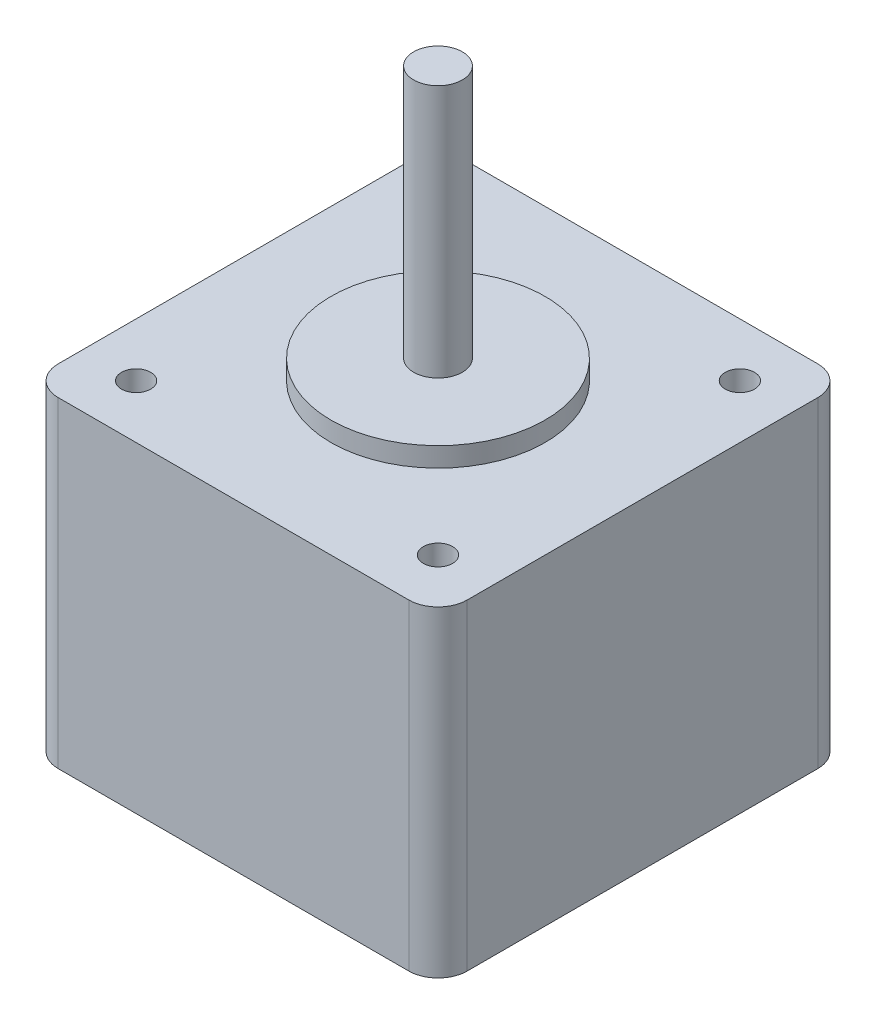
ISO-10303-21;
HEADER;
FILE_DESCRIPTION(('STEP AP214'),'2;1');
FILE_NAME('part.step','',(''),(''),'','','');
FILE_SCHEMA(('AUTOMOTIVE_DESIGN { 1 0 10303 214 1 1 1 1 }'));
ENDSEC;
DATA;
#1=APPLICATION_CONTEXT('core data for automotive mechanical design processes');
#2=APPLICATION_PROTOCOL_DEFINITION('international standard','automotive_design',2000,#1);
#3=PRODUCT_CONTEXT('',#1,'mechanical');
#4=PRODUCT('Part','Part','',(#3));
#5=PRODUCT_RELATED_PRODUCT_CATEGORY('part','',(#4));
#6=PRODUCT_DEFINITION_FORMATION('','',#4);
#7=PRODUCT_DEFINITION_CONTEXT('part definition',#1,'design');
#8=PRODUCT_DEFINITION('design','',#6,#7);
#9=PRODUCT_DEFINITION_SHAPE('','',#8);
#10=(LENGTH_UNIT() NAMED_UNIT(*) SI_UNIT(.MILLI.,.METRE.));
#11=(NAMED_UNIT(*) PLANE_ANGLE_UNIT() SI_UNIT($,.RADIAN.));
#12=(NAMED_UNIT(*) SI_UNIT($,.STERADIAN.) SOLID_ANGLE_UNIT());
#13=UNCERTAINTY_MEASURE_WITH_UNIT(LENGTH_MEASURE(1.E-05),#10,'distance_accuracy_value','');
#14=(GEOMETRIC_REPRESENTATION_CONTEXT(3) GLOBAL_UNCERTAINTY_ASSIGNED_CONTEXT((#13)) GLOBAL_UNIT_ASSIGNED_CONTEXT((#10,
#11,#12)) REPRESENTATION_CONTEXT('',''));
#15=CARTESIAN_POINT('',(0.,0.,0.));
#16=DIRECTION('',(0.,0.,1.));
#17=DIRECTION('',(1.,0.,0.));
#18=AXIS2_PLACEMENT_3D('',#15,#16,#17);
#19=CARTESIAN_POINT('',(0.,33.,0.));
#20=DIRECTION('',(0.,1.,0.));
#21=DIRECTION('',(0.,0.,1.));
#22=AXIS2_PLACEMENT_3D('',#19,#20,#21);
#23=PLANE('',#22);
#24=CARTESIAN_POINT('',(21.,33.,-21.));
#25=DIRECTION('',(0.,1.,0.));
#26=DIRECTION('',(0.,0.,1.));
#27=AXIS2_PLACEMENT_3D('',#24,#25,#26);
#28=CIRCLE('',#27,11.);
#29=CARTESIAN_POINT('',(21.,33.,-9.99999999999999));
#30=VERTEX_POINT('',#29);
#31=EDGE_CURVE('E214',#30,#30,#28,.T.);
#32=ORIENTED_EDGE('',*,*,#31,.F.);
#33=EDGE_LOOP('',(#32));
#34=FACE_BOUND('',#33,.T.);
#35=CARTESIAN_POINT('',(5.50000000000001,33.,-5.50000000000001));
#36=DIRECTION('',(0.,-1.,0.));
#37=DIRECTION('',(0.,0.,-1.));
#38=AXIS2_PLACEMENT_3D('',#35,#36,#37);
#39=CIRCLE('',#38,1.5);
#40=CARTESIAN_POINT('',(5.50000000000001,33.,-7.));
#41=VERTEX_POINT('',#40);
#42=EDGE_CURVE('E200',#41,#41,#39,.T.);
#43=ORIENTED_EDGE('',*,*,#42,.T.);
#44=EDGE_LOOP('',(#43));
#45=FACE_BOUND('',#44,.T.);
#46=CARTESIAN_POINT('',(36.5,33.,-5.50000000000001));
#47=DIRECTION('',(0.,1.,0.));
#48=DIRECTION('',(0.,0.,1.));
#49=AXIS2_PLACEMENT_3D('',#46,#47,#48);
#50=CIRCLE('',#49,1.5);
#51=CARTESIAN_POINT('',(36.5,33.,-4.));
#52=VERTEX_POINT('',#51);
#53=EDGE_CURVE('E201',#52,#52,#50,.T.);
#54=ORIENTED_EDGE('',*,*,#53,.F.);
#55=EDGE_LOOP('',(#54));
#56=FACE_BOUND('',#55,.T.);
#57=CARTESIAN_POINT('',(5.50000000000001,33.,-36.5));
#58=DIRECTION('',(0.,1.,0.));
#59=DIRECTION('',(0.,0.,1.));
#60=AXIS2_PLACEMENT_3D('',#57,#58,#59);
#61=CIRCLE('',#60,1.5);
#62=CARTESIAN_POINT('',(5.50000000000001,33.,-35.));
#63=VERTEX_POINT('',#62);
#64=EDGE_CURVE('E191',#63,#63,#61,.T.);
#65=ORIENTED_EDGE('',*,*,#64,.F.);
#66=EDGE_LOOP('',(#65));
#67=FACE_BOUND('',#66,.T.);
#68=DIRECTION('',(0.,0.,-1.));
#69=VECTOR('',#68,1.);
#70=CARTESIAN_POINT('',(42.,33.,0.));
#71=LINE('',#70,#69);
#72=CARTESIAN_POINT('',(42.,33.,-3.));
#73=VERTEX_POINT('',#72);
#74=CARTESIAN_POINT('',(42.,33.,-39.));
#75=VERTEX_POINT('',#74);
#76=EDGE_CURVE('E146',#73,#75,#71,.T.);
#77=ORIENTED_EDGE('',*,*,#76,.T.);
#78=CARTESIAN_POINT('',(39.,33.,-39.));
#79=DIRECTION('',(0.,1.,0.));
#80=DIRECTION('',(0.,0.,1.));
#81=AXIS2_PLACEMENT_3D('',#78,#79,#80);
#82=CIRCLE('',#81,3.);
#83=CARTESIAN_POINT('',(39.,33.,-42.));
#84=VERTEX_POINT('',#83);
#85=EDGE_CURVE('E165',#75,#84,#82,.T.);
#86=ORIENTED_EDGE('',*,*,#85,.T.);
#87=DIRECTION('',(-1.,0.,0.));
#88=VECTOR('',#87,1.);
#89=CARTESIAN_POINT('',(42.,33.,-42.));
#90=LINE('',#89,#88);
#91=CARTESIAN_POINT('',(3.00000000000001,33.,-42.));
#92=VERTEX_POINT('',#91);
#93=EDGE_CURVE('E130',#84,#92,#90,.T.);
#94=ORIENTED_EDGE('',*,*,#93,.T.);
#95=CARTESIAN_POINT('',(3.,33.,-39.));
#96=DIRECTION('',(0.,1.,0.));
#97=DIRECTION('',(0.,0.,1.));
#98=AXIS2_PLACEMENT_3D('',#95,#96,#97);
#99=CIRCLE('',#98,3.);
#100=CARTESIAN_POINT('',(0.,33.,-39.));
#101=VERTEX_POINT('',#100);
#102=EDGE_CURVE('E160',#92,#101,#99,.T.);
#103=ORIENTED_EDGE('',*,*,#102,.T.);
#104=DIRECTION('',(0.,0.,1.));
#105=VECTOR('',#104,1.);
#106=CARTESIAN_POINT('',(0.,33.,-42.));
#107=LINE('',#106,#105);
#108=CARTESIAN_POINT('',(0.,33.,-3.00000000000002));
#109=VERTEX_POINT('',#108);
#110=EDGE_CURVE('E177',#101,#109,#107,.T.);
#111=ORIENTED_EDGE('',*,*,#110,.T.);
#112=CARTESIAN_POINT('',(3.,33.,-3.));
#113=DIRECTION('',(0.,1.,0.));
#114=DIRECTION('',(0.,0.,1.));
#115=AXIS2_PLACEMENT_3D('',#112,#113,#114);
#116=CIRCLE('',#115,3.);
#117=CARTESIAN_POINT('',(3.,33.,0.));
#118=VERTEX_POINT('',#117);
#119=EDGE_CURVE('E66',#109,#118,#116,.T.);
#120=ORIENTED_EDGE('',*,*,#119,.T.);
#121=DIRECTION('',(1.,0.,0.));
#122=VECTOR('',#121,1.);
#123=CARTESIAN_POINT('',(0.,33.,0.));
#124=LINE('',#123,#122);
#125=CARTESIAN_POINT('',(39.,33.,0.));
#126=VERTEX_POINT('',#125);
#127=EDGE_CURVE('E185',#118,#126,#124,.T.);
#128=ORIENTED_EDGE('',*,*,#127,.T.);
#129=CARTESIAN_POINT('',(39.,33.,-3.));
#130=DIRECTION('',(0.,1.,0.));
#131=DIRECTION('',(0.,0.,1.));
#132=AXIS2_PLACEMENT_3D('',#129,#130,#131);
#133=CIRCLE('',#132,3.);
#134=EDGE_CURVE('E163',#126,#73,#133,.T.);
#135=ORIENTED_EDGE('',*,*,#134,.T.);
#136=EDGE_LOOP('',(#77,#86,#94,#103,#111,#120,#128,#135));
#137=FACE_BOUND('',#136,.T.);
#138=CARTESIAN_POINT('',(36.5,33.,-36.5));
#139=DIRECTION('',(0.,-1.,0.));
#140=DIRECTION('',(0.,0.,-1.));
#141=AXIS2_PLACEMENT_3D('',#138,#139,#140);
#142=CIRCLE('',#141,1.5);
#143=CARTESIAN_POINT('',(36.5,33.,-38.));
#144=VERTEX_POINT('',#143);
#145=EDGE_CURVE('E194',#144,#144,#142,.T.);
#146=ORIENTED_EDGE('',*,*,#145,.T.);
#147=EDGE_LOOP('',(#146));
#148=FACE_BOUND('',#147,.T.);
#149=ADVANCED_FACE('F43',(#34,#45,#56,#67,#137,#148),#23,.T.);
#150=CARTESIAN_POINT('',(42.,33.,-42.));
#151=DIRECTION('',(0.,0.,1.));
#152=DIRECTION('',(1.,0.,0.));
#153=AXIS2_PLACEMENT_3D('',#150,#151,#152);
#154=PLANE('',#153);
#155=ORIENTED_EDGE('',*,*,#93,.F.);
#156=DIRECTION('',(0.,-1.,0.));
#157=VECTOR('',#156,1.);
#158=CARTESIAN_POINT('',(39.,33.,-42.));
#159=LINE('',#158,#157);
#160=CARTESIAN_POINT('',(39.,0.,-42.));
#161=VERTEX_POINT('',#160);
#162=EDGE_CURVE('E114',#84,#161,#159,.T.);
#163=ORIENTED_EDGE('',*,*,#162,.T.);
#164=DIRECTION('',(-1.,0.,0.));
#165=VECTOR('',#164,1.);
#166=CARTESIAN_POINT('',(42.,0.,-42.));
#167=LINE('',#166,#165);
#168=CARTESIAN_POINT('',(3.00000000000001,0.,-42.));
#169=VERTEX_POINT('',#168);
#170=EDGE_CURVE('E127',#161,#169,#167,.T.);
#171=ORIENTED_EDGE('',*,*,#170,.T.);
#172=DIRECTION('',(0.,-1.,0.));
#173=VECTOR('',#172,1.);
#174=CARTESIAN_POINT('',(3.,33.,-42.));
#175=LINE('',#174,#173);
#176=EDGE_CURVE('E132',#169,#92,#175,.F.);
#177=ORIENTED_EDGE('',*,*,#176,.T.);
#178=EDGE_LOOP('',(#155,#163,#171,#177));
#179=FACE_BOUND('',#178,.T.);
#180=ADVANCED_FACE('F126',(#179),#154,.F.);
#181=CARTESIAN_POINT('',(0.,33.,-42.));
#182=DIRECTION('',(1.,0.,0.));
#183=DIRECTION('',(0.,0.,-1.));
#184=AXIS2_PLACEMENT_3D('',#181,#182,#183);
#185=PLANE('',#184);
#186=DIRECTION('',(0.,0.,1.));
#187=VECTOR('',#186,1.);
#188=CARTESIAN_POINT('',(0.,0.,-42.));
#189=LINE('',#188,#187);
#190=CARTESIAN_POINT('',(0.,0.,-39.));
#191=VERTEX_POINT('',#190);
#192=CARTESIAN_POINT('',(0.,0.,-3.00000000000002));
#193=VERTEX_POINT('',#192);
#194=EDGE_CURVE('E136',#191,#193,#189,.T.);
#195=ORIENTED_EDGE('',*,*,#194,.T.);
#196=DIRECTION('',(0.,-1.,0.));
#197=VECTOR('',#196,1.);
#198=CARTESIAN_POINT('',(0.,33.,-3.));
#199=LINE('',#198,#197);
#200=EDGE_CURVE('E11',#193,#109,#199,.F.);
#201=ORIENTED_EDGE('',*,*,#200,.T.);
#202=ORIENTED_EDGE('',*,*,#110,.F.);
#203=DIRECTION('',(0.,-1.,0.));
#204=VECTOR('',#203,1.);
#205=CARTESIAN_POINT('',(0.,33.,-39.));
#206=LINE('',#205,#204);
#207=EDGE_CURVE('E52',#101,#191,#206,.T.);
#208=ORIENTED_EDGE('',*,*,#207,.T.);
#209=EDGE_LOOP('',(#195,#201,#202,#208));
#210=FACE_BOUND('',#209,.T.);
#211=ADVANCED_FACE('F175',(#210),#185,.F.);
#212=CARTESIAN_POINT('',(0.,33.,0.));
#213=DIRECTION('',(0.,0.,-1.));
#214=DIRECTION('',(-1.,0.,0.));
#215=AXIS2_PLACEMENT_3D('',#212,#213,#214);
#216=PLANE('',#215);
#217=DIRECTION('',(1.,0.,0.));
#218=VECTOR('',#217,1.);
#219=CARTESIAN_POINT('',(0.,0.,0.));
#220=LINE('',#219,#218);
#221=CARTESIAN_POINT('',(3.,0.,0.));
#222=VERTEX_POINT('',#221);
#223=CARTESIAN_POINT('',(39.,0.,0.));
#224=VERTEX_POINT('',#223);
#225=EDGE_CURVE('E140',#222,#224,#220,.T.);
#226=ORIENTED_EDGE('',*,*,#225,.T.);
#227=DIRECTION('',(0.,-1.,0.));
#228=VECTOR('',#227,1.);
#229=CARTESIAN_POINT('',(39.,33.,0.));
#230=LINE('',#229,#228);
#231=EDGE_CURVE('E59',#224,#126,#230,.F.);
#232=ORIENTED_EDGE('',*,*,#231,.T.);
#233=ORIENTED_EDGE('',*,*,#127,.F.);
#234=DIRECTION('',(0.,-1.,0.));
#235=VECTOR('',#234,1.);
#236=CARTESIAN_POINT('',(3.,33.,0.));
#237=LINE('',#236,#235);
#238=EDGE_CURVE('E167',#118,#222,#237,.T.);
#239=ORIENTED_EDGE('',*,*,#238,.T.);
#240=EDGE_LOOP('',(#226,#232,#233,#239));
#241=FACE_BOUND('',#240,.T.);
#242=ADVANCED_FACE('F184',(#241),#216,.F.);
#243=CARTESIAN_POINT('',(42.,33.,0.));
#244=DIRECTION('',(-1.,0.,0.));
#245=DIRECTION('',(0.,0.,1.));
#246=AXIS2_PLACEMENT_3D('',#243,#244,#245);
#247=PLANE('',#246);
#248=DIRECTION('',(0.,0.,-1.));
#249=VECTOR('',#248,1.);
#250=CARTESIAN_POINT('',(42.,0.,0.));
#251=LINE('',#250,#249);
#252=CARTESIAN_POINT('',(42.,0.,-3.));
#253=VERTEX_POINT('',#252);
#254=CARTESIAN_POINT('',(42.,0.,-39.));
#255=VERTEX_POINT('',#254);
#256=EDGE_CURVE('E150',#253,#255,#251,.T.);
#257=ORIENTED_EDGE('',*,*,#256,.T.);
#258=DIRECTION('',(0.,-1.,0.));
#259=VECTOR('',#258,1.);
#260=CARTESIAN_POINT('',(42.,33.,-39.));
#261=LINE('',#260,#259);
#262=EDGE_CURVE('E115',#255,#75,#261,.F.);
#263=ORIENTED_EDGE('',*,*,#262,.T.);
#264=ORIENTED_EDGE('',*,*,#76,.F.);
#265=DIRECTION('',(0.,-1.,0.));
#266=VECTOR('',#265,1.);
#267=CARTESIAN_POINT('',(42.,33.,-3.));
#268=LINE('',#267,#266);
#269=EDGE_CURVE('E120',#73,#253,#268,.T.);
#270=ORIENTED_EDGE('',*,*,#269,.T.);
#271=EDGE_LOOP('',(#257,#263,#264,#270));
#272=FACE_BOUND('',#271,.T.);
#273=ADVANCED_FACE('F254',(#272),#247,.F.);
#274=CARTESIAN_POINT('',(0.,0.,0.));
#275=DIRECTION('',(0.,1.,0.));
#276=DIRECTION('',(0.,0.,1.));
#277=AXIS2_PLACEMENT_3D('',#274,#275,#276);
#278=PLANE('',#277);
#279=ORIENTED_EDGE('',*,*,#170,.F.);
#280=CARTESIAN_POINT('',(39.,0.,-39.));
#281=DIRECTION('',(0.,1.,0.));
#282=DIRECTION('',(0.,0.,1.));
#283=AXIS2_PLACEMENT_3D('',#280,#281,#282);
#284=CIRCLE('',#283,3.);
#285=EDGE_CURVE('E110',#161,#255,#284,.F.);
#286=ORIENTED_EDGE('',*,*,#285,.T.);
#287=ORIENTED_EDGE('',*,*,#256,.F.);
#288=CARTESIAN_POINT('',(39.,0.,-3.));
#289=DIRECTION('',(0.,1.,0.));
#290=DIRECTION('',(0.,0.,1.));
#291=AXIS2_PLACEMENT_3D('',#288,#289,#290);
#292=CIRCLE('',#291,3.);
#293=EDGE_CURVE('E121',#253,#224,#292,.F.);
#294=ORIENTED_EDGE('',*,*,#293,.T.);
#295=ORIENTED_EDGE('',*,*,#225,.F.);
#296=CARTESIAN_POINT('',(3.,0.,-3.));
#297=DIRECTION('',(0.,1.,0.));
#298=DIRECTION('',(0.,0.,1.));
#299=AXIS2_PLACEMENT_3D('',#296,#297,#298);
#300=CIRCLE('',#299,3.);
#301=EDGE_CURVE('E154',#222,#193,#300,.F.);
#302=ORIENTED_EDGE('',*,*,#301,.T.);
#303=ORIENTED_EDGE('',*,*,#194,.F.);
#304=CARTESIAN_POINT('',(3.,0.,-39.));
#305=DIRECTION('',(0.,1.,0.));
#306=DIRECTION('',(0.,0.,1.));
#307=AXIS2_PLACEMENT_3D('',#304,#305,#306);
#308=CIRCLE('',#307,3.);
#309=EDGE_CURVE('E131',#191,#169,#308,.F.);
#310=ORIENTED_EDGE('',*,*,#309,.T.);
#311=EDGE_LOOP('',(#279,#286,#287,#294,#295,#302,#303,#310));
#312=FACE_BOUND('',#311,.T.);
#313=ADVANCED_FACE('F134',(#312),#278,.F.);
#314=CARTESIAN_POINT('',(39.,33.,-39.));
#315=DIRECTION('',(0.,-1.,0.));
#316=DIRECTION('',(0.,0.,-1.));
#317=AXIS2_PLACEMENT_3D('',#314,#315,#316);
#318=CYLINDRICAL_SURFACE('',#317,3.);
#319=ORIENTED_EDGE('',*,*,#85,.F.);
#320=ORIENTED_EDGE('',*,*,#262,.F.);
#321=ORIENTED_EDGE('',*,*,#285,.F.);
#322=ORIENTED_EDGE('',*,*,#162,.F.);
#323=EDGE_LOOP('',(#319,#320,#321,#322));
#324=FACE_BOUND('',#323,.T.);
#325=ADVANCED_FACE('F113',(#324),#318,.T.);
#326=CARTESIAN_POINT('',(39.,33.,-3.));
#327=DIRECTION('',(0.,-1.,0.));
#328=DIRECTION('',(0.,0.,-1.));
#329=AXIS2_PLACEMENT_3D('',#326,#327,#328);
#330=CYLINDRICAL_SURFACE('',#329,3.);
#331=ORIENTED_EDGE('',*,*,#134,.F.);
#332=ORIENTED_EDGE('',*,*,#231,.F.);
#333=ORIENTED_EDGE('',*,*,#293,.F.);
#334=ORIENTED_EDGE('',*,*,#269,.F.);
#335=EDGE_LOOP('',(#331,#332,#333,#334));
#336=FACE_BOUND('',#335,.T.);
#337=ADVANCED_FACE('F264',(#336),#330,.T.);
#338=CARTESIAN_POINT('',(3.,33.,-3.));
#339=DIRECTION('',(0.,-1.,0.));
#340=DIRECTION('',(0.,0.,-1.));
#341=AXIS2_PLACEMENT_3D('',#338,#339,#340);
#342=CYLINDRICAL_SURFACE('',#341,3.);
#343=ORIENTED_EDGE('',*,*,#119,.F.);
#344=ORIENTED_EDGE('',*,*,#200,.F.);
#345=ORIENTED_EDGE('',*,*,#301,.F.);
#346=ORIENTED_EDGE('',*,*,#238,.F.);
#347=EDGE_LOOP('',(#343,#344,#345,#346));
#348=FACE_BOUND('',#347,.T.);
#349=ADVANCED_FACE('F183',(#348),#342,.T.);
#350=CARTESIAN_POINT('',(3.,33.,-39.));
#351=DIRECTION('',(0.,-1.,0.));
#352=DIRECTION('',(0.,0.,-1.));
#353=AXIS2_PLACEMENT_3D('',#350,#351,#352);
#354=CYLINDRICAL_SURFACE('',#353,3.);
#355=ORIENTED_EDGE('',*,*,#102,.F.);
#356=ORIENTED_EDGE('',*,*,#176,.F.);
#357=ORIENTED_EDGE('',*,*,#309,.F.);
#358=ORIENTED_EDGE('',*,*,#207,.F.);
#359=EDGE_LOOP('',(#355,#356,#357,#358));
#360=FACE_BOUND('',#359,.T.);
#361=ADVANCED_FACE('F45',(#360),#354,.T.);
#362=CARTESIAN_POINT('',(5.50000000000001,28.5,-36.5));
#363=DIRECTION('',(0.,1.,0.));
#364=DIRECTION('',(0.,0.,1.));
#365=AXIS2_PLACEMENT_3D('',#362,#363,#364);
#366=CYLINDRICAL_SURFACE('',#365,1.5);
#367=CARTESIAN_POINT('',(5.50000000000001,28.5,-36.5));
#368=DIRECTION('',(0.,1.,0.));
#369=DIRECTION('',(0.,0.,1.));
#370=AXIS2_PLACEMENT_3D('',#367,#368,#369);
#371=CIRCLE('',#370,1.5);
#372=CARTESIAN_POINT('',(5.50000000000001,28.5,-35.));
#373=VERTEX_POINT('',#372);
#374=EDGE_CURVE('E143',#373,#373,#371,.T.);
#375=ORIENTED_EDGE('',*,*,#374,.F.);
#376=EDGE_LOOP('',(#375));
#377=FACE_BOUND('',#376,.T.);
#378=ORIENTED_EDGE('',*,*,#64,.T.);
#379=EDGE_LOOP('',(#378));
#380=FACE_BOUND('',#379,.T.);
#381=ADVANCED_FACE('F271',(#377,#380),#366,.F.);
#382=CARTESIAN_POINT('',(5.50000000000001,28.5,-36.5));
#383=DIRECTION('',(0.,1.,0.));
#384=DIRECTION('',(0.,0.,1.));
#385=AXIS2_PLACEMENT_3D('',#382,#383,#384);
#386=PLANE('',#385);
#387=ORIENTED_EDGE('',*,*,#374,.T.);
#388=EDGE_LOOP('',(#387));
#389=FACE_BOUND('',#388,.T.);
#390=ADVANCED_FACE('F275',(#389),#386,.T.);
#391=CARTESIAN_POINT('',(36.5,28.5,-5.50000000000001));
#392=DIRECTION('',(0.,1.,0.));
#393=DIRECTION('',(0.,0.,1.));
#394=AXIS2_PLACEMENT_3D('',#391,#392,#393);
#395=CYLINDRICAL_SURFACE('',#394,1.5);
#396=CARTESIAN_POINT('',(36.5,28.5,-5.50000000000001));
#397=DIRECTION('',(0.,1.,0.));
#398=DIRECTION('',(0.,0.,1.));
#399=AXIS2_PLACEMENT_3D('',#396,#397,#398);
#400=CIRCLE('',#399,1.5);
#401=CARTESIAN_POINT('',(36.5,28.5,-4.));
#402=VERTEX_POINT('',#401);
#403=EDGE_CURVE('E209',#402,#402,#400,.T.);
#404=ORIENTED_EDGE('',*,*,#403,.F.);
#405=EDGE_LOOP('',(#404));
#406=FACE_BOUND('',#405,.T.);
#407=ORIENTED_EDGE('',*,*,#53,.T.);
#408=EDGE_LOOP('',(#407));
#409=FACE_BOUND('',#408,.T.);
#410=ADVANCED_FACE('F305',(#406,#409),#395,.F.);
#411=CARTESIAN_POINT('',(36.5,28.5,-5.50000000000001));
#412=DIRECTION('',(0.,1.,0.));
#413=DIRECTION('',(0.,0.,1.));
#414=AXIS2_PLACEMENT_3D('',#411,#412,#413);
#415=PLANE('',#414);
#416=ORIENTED_EDGE('',*,*,#403,.T.);
#417=EDGE_LOOP('',(#416));
#418=FACE_BOUND('',#417,.T.);
#419=ADVANCED_FACE('F298',(#418),#415,.T.);
#420=CARTESIAN_POINT('',(5.50000000000001,28.5,-5.50000000000001));
#421=DIRECTION('',(0.,1.,0.));
#422=DIRECTION('',(0.,0.,1.));
#423=AXIS2_PLACEMENT_3D('',#420,#421,#422);
#424=CYLINDRICAL_SURFACE('',#423,1.5);
#425=CARTESIAN_POINT('',(5.50000000000001,28.5,-5.50000000000001));
#426=DIRECTION('',(0.,-1.,0.));
#427=DIRECTION('',(0.,0.,-1.));
#428=AXIS2_PLACEMENT_3D('',#425,#426,#427);
#429=CIRCLE('',#428,1.5);
#430=CARTESIAN_POINT('',(5.50000000000001,28.5,-7.));
#431=VERTEX_POINT('',#430);
#432=EDGE_CURVE('E197',#431,#431,#429,.T.);
#433=ORIENTED_EDGE('',*,*,#432,.T.);
#434=EDGE_LOOP('',(#433));
#435=FACE_BOUND('',#434,.T.);
#436=ORIENTED_EDGE('',*,*,#42,.F.);
#437=EDGE_LOOP('',(#436));
#438=FACE_BOUND('',#437,.T.);
#439=ADVANCED_FACE('F294',(#435,#438),#424,.F.);
#440=CARTESIAN_POINT('',(5.50000000000001,28.5,-5.50000000000001));
#441=DIRECTION('',(0.,-1.,0.));
#442=DIRECTION('',(0.,0.,-1.));
#443=AXIS2_PLACEMENT_3D('',#440,#441,#442);
#444=PLANE('',#443);
#445=ORIENTED_EDGE('',*,*,#432,.F.);
#446=EDGE_LOOP('',(#445));
#447=FACE_BOUND('',#446,.T.);
#448=ADVANCED_FACE('F285',(#447),#444,.F.);
#449=CARTESIAN_POINT('',(36.5,28.5,-36.5));
#450=DIRECTION('',(0.,1.,0.));
#451=DIRECTION('',(0.,0.,1.));
#452=AXIS2_PLACEMENT_3D('',#449,#450,#451);
#453=CYLINDRICAL_SURFACE('',#452,1.5);
#454=CARTESIAN_POINT('',(36.5,28.5,-36.5));
#455=DIRECTION('',(0.,-1.,0.));
#456=DIRECTION('',(0.,0.,-1.));
#457=AXIS2_PLACEMENT_3D('',#454,#455,#456);
#458=CIRCLE('',#457,1.5);
#459=CARTESIAN_POINT('',(36.5,28.5,-38.));
#460=VERTEX_POINT('',#459);
#461=EDGE_CURVE('E204',#460,#460,#458,.T.);
#462=ORIENTED_EDGE('',*,*,#461,.T.);
#463=EDGE_LOOP('',(#462));
#464=FACE_BOUND('',#463,.T.);
#465=ORIENTED_EDGE('',*,*,#145,.F.);
#466=EDGE_LOOP('',(#465));
#467=FACE_BOUND('',#466,.T.);
#468=ADVANCED_FACE('F283',(#464,#467),#453,.F.);
#469=CARTESIAN_POINT('',(36.5,28.5,-36.5));
#470=DIRECTION('',(0.,-1.,0.));
#471=DIRECTION('',(0.,0.,-1.));
#472=AXIS2_PLACEMENT_3D('',#469,#470,#471);
#473=PLANE('',#472);
#474=ORIENTED_EDGE('',*,*,#461,.F.);
#475=EDGE_LOOP('',(#474));
#476=FACE_BOUND('',#475,.T.);
#477=ADVANCED_FACE('F238',(#476),#473,.F.);
#478=CARTESIAN_POINT('',(21.,35.,-21.));
#479=DIRECTION('',(0.,-1.,0.));
#480=DIRECTION('',(0.,0.,-1.));
#481=AXIS2_PLACEMENT_3D('',#478,#479,#480);
#482=CYLINDRICAL_SURFACE('',#481,11.);
#483=CARTESIAN_POINT('',(21.,35.,-21.));
#484=DIRECTION('',(0.,1.,0.));
#485=DIRECTION('',(0.,0.,1.));
#486=AXIS2_PLACEMENT_3D('',#483,#484,#485);
#487=CIRCLE('',#486,11.);
#488=CARTESIAN_POINT('',(21.,35.,-9.99999999999999));
#489=VERTEX_POINT('',#488);
#490=EDGE_CURVE('E217',#489,#489,#487,.T.);
#491=ORIENTED_EDGE('',*,*,#490,.F.);
#492=EDGE_LOOP('',(#491));
#493=FACE_BOUND('',#492,.T.);
#494=ORIENTED_EDGE('',*,*,#31,.T.);
#495=EDGE_LOOP('',(#494));
#496=FACE_BOUND('',#495,.T.);
#497=ADVANCED_FACE('F230',(#493,#496),#482,.T.);
#498=CARTESIAN_POINT('',(21.,35.,-21.));
#499=DIRECTION('',(0.,1.,0.));
#500=DIRECTION('',(0.,0.,1.));
#501=AXIS2_PLACEMENT_3D('',#498,#499,#500);
#502=PLANE('',#501);
#503=CARTESIAN_POINT('',(21.,35.,-21.));
#504=DIRECTION('',(0.,1.,0.));
#505=DIRECTION('',(0.,0.,1.));
#506=AXIS2_PLACEMENT_3D('',#503,#504,#505);
#507=CIRCLE('',#506,2.5);
#508=CARTESIAN_POINT('',(21.,35.,-23.5));
#509=VERTEX_POINT('',#508);
#510=EDGE_CURVE('E47',#509,#509,#507,.T.);
#511=ORIENTED_EDGE('',*,*,#510,.F.);
#512=EDGE_LOOP('',(#511));
#513=FACE_BOUND('',#512,.T.);
#514=ORIENTED_EDGE('',*,*,#490,.T.);
#515=EDGE_LOOP('',(#514));
#516=FACE_BOUND('',#515,.T.);
#517=ADVANCED_FACE('F227',(#513,#516),#502,.T.);
#518=CARTESIAN_POINT('',(21.,61.,-21.));
#519=DIRECTION('',(0.,1.,0.));
#520=DIRECTION('',(0.,0.,1.));
#521=AXIS2_PLACEMENT_3D('',#518,#519,#520);
#522=PLANE('',#521);
#523=CARTESIAN_POINT('',(21.,61.,-21.));
#524=DIRECTION('',(0.,1.,0.));
#525=DIRECTION('',(0.,0.,1.));
#526=AXIS2_PLACEMENT_3D('',#523,#524,#525);
#527=CIRCLE('',#526,2.5);
#528=CARTESIAN_POINT('',(21.,61.,-23.5));
#529=VERTEX_POINT('',#528);
#530=EDGE_CURVE('E137',#529,#529,#527,.T.);
#531=ORIENTED_EDGE('',*,*,#530,.T.);
#532=EDGE_LOOP('',(#531));
#533=FACE_BOUND('',#532,.T.);
#534=ADVANCED_FACE('F229',(#533),#522,.T.);
#535=CARTESIAN_POINT('',(21.,61.,-21.));
#536=DIRECTION('',(0.,-1.,0.));
#537=DIRECTION('',(0.,0.,-1.));
#538=AXIS2_PLACEMENT_3D('',#535,#536,#537);
#539=CYLINDRICAL_SURFACE('',#538,2.5);
#540=CARTESIAN_POINT('',(21.,35.,-23.5));
#541=CARTESIAN_POINT('',(21.,35.2708333333333,-23.5));
#542=CARTESIAN_POINT('',(21.,35.5416666666667,-23.5));
#543=CARTESIAN_POINT('',(21.,36.0833333333333,-23.5));
#544=CARTESIAN_POINT('',(21.,36.3541666666667,-23.5));
#545=CARTESIAN_POINT('',(21.,36.8958333333333,-23.5));
#546=CARTESIAN_POINT('',(21.,37.1666666666667,-23.5));
#547=CARTESIAN_POINT('',(21.,37.7083333333333,-23.5));
#548=CARTESIAN_POINT('',(21.,37.9791666666667,-23.5));
#549=CARTESIAN_POINT('',(21.,38.5208333333333,-23.5));
#550=CARTESIAN_POINT('',(21.,38.7916666666667,-23.5));
#551=CARTESIAN_POINT('',(21.,39.3333333333333,-23.5));
#552=CARTESIAN_POINT('',(21.,39.6041666666667,-23.5));
#553=CARTESIAN_POINT('',(21.,40.1458333333333,-23.5));
#554=CARTESIAN_POINT('',(21.,40.4166666666667,-23.5));
#555=CARTESIAN_POINT('',(21.,40.9583333333333,-23.5));
#556=CARTESIAN_POINT('',(21.,41.2291666666667,-23.5));
#557=CARTESIAN_POINT('',(21.,41.7708333333333,-23.5));
#558=CARTESIAN_POINT('',(21.,42.0416666666667,-23.5));
#559=CARTESIAN_POINT('',(21.,42.5833333333333,-23.5));
#560=CARTESIAN_POINT('',(21.,42.8541666666667,-23.5));
#561=CARTESIAN_POINT('',(21.,43.3958333333333,-23.5));
#562=CARTESIAN_POINT('',(21.,43.6666666666667,-23.5));
#563=CARTESIAN_POINT('',(21.,44.2083333333333,-23.5));
#564=CARTESIAN_POINT('',(21.,44.4791666666667,-23.5));
#565=CARTESIAN_POINT('',(21.,45.0208333333333,-23.5));
#566=CARTESIAN_POINT('',(21.,45.2916666666667,-23.5));
#567=CARTESIAN_POINT('',(21.,45.8333333333333,-23.5));
#568=CARTESIAN_POINT('',(21.,46.1041666666667,-23.5));
#569=CARTESIAN_POINT('',(21.,46.6458333333333,-23.5));
#570=CARTESIAN_POINT('',(21.,46.9166666666667,-23.5));
#571=CARTESIAN_POINT('',(21.,47.4583333333333,-23.5));
#572=CARTESIAN_POINT('',(21.,47.7291666666667,-23.5));
#573=CARTESIAN_POINT('',(21.,48.2708333333333,-23.5));
#574=CARTESIAN_POINT('',(21.,48.5416666666667,-23.5));
#575=CARTESIAN_POINT('',(21.,49.0833333333333,-23.5));
#576=CARTESIAN_POINT('',(21.,49.3541666666667,-23.5));
#577=CARTESIAN_POINT('',(21.,49.8958333333333,-23.5));
#578=CARTESIAN_POINT('',(21.,50.1666666666667,-23.5));
#579=CARTESIAN_POINT('',(21.,50.7083333333333,-23.5));
#580=CARTESIAN_POINT('',(21.,50.9791666666667,-23.5));
#581=CARTESIAN_POINT('',(21.,51.5208333333333,-23.5));
#582=CARTESIAN_POINT('',(21.,51.7916666666667,-23.5));
#583=CARTESIAN_POINT('',(21.,52.3333333333333,-23.5));
#584=CARTESIAN_POINT('',(21.,52.6041666666667,-23.5));
#585=CARTESIAN_POINT('',(21.,53.1458333333333,-23.5));
#586=CARTESIAN_POINT('',(21.,53.4166666666667,-23.5));
#587=CARTESIAN_POINT('',(21.,53.9583333333333,-23.5));
#588=CARTESIAN_POINT('',(21.,54.2291666666667,-23.5));
#589=CARTESIAN_POINT('',(21.,54.7708333333333,-23.5));
#590=CARTESIAN_POINT('',(21.,55.0416666666667,-23.5));
#591=CARTESIAN_POINT('',(21.,55.5833333333333,-23.5));
#592=CARTESIAN_POINT('',(21.,55.8541666666667,-23.5));
#593=CARTESIAN_POINT('',(21.,56.3958333333333,-23.5));
#594=CARTESIAN_POINT('',(21.,56.6666666666667,-23.5));
#595=CARTESIAN_POINT('',(21.,57.2083333333333,-23.5));
#596=CARTESIAN_POINT('',(21.,57.4791666666667,-23.5));
#597=CARTESIAN_POINT('',(21.,58.0208333333333,-23.5));
#598=CARTESIAN_POINT('',(21.,58.2916666666667,-23.5));
#599=CARTESIAN_POINT('',(21.,58.8333333333333,-23.5));
#600=CARTESIAN_POINT('',(21.,59.1041666666667,-23.5));
#601=CARTESIAN_POINT('',(21.,59.6458333333333,-23.5));
#602=CARTESIAN_POINT('',(21.,59.9166666666667,-23.5));
#603=CARTESIAN_POINT('',(21.,60.4583333333333,-23.5));
#604=CARTESIAN_POINT('',(21.,60.7291666666667,-23.5));
#605=CARTESIAN_POINT('',(21.,61.,-23.5));
#606=B_SPLINE_CURVE_WITH_KNOTS('',3,(#540,#541,#542,#543,#544,#545,#546,#547,#548,#549,#550,
#551,#552,#553,#554,#555,#556,#557,#558,#559,#560,#561,#562,#563,#564,#565,#566,#567,#568,#569,
#570,#571,#572,#573,#574,#575,#576,#577,#578,#579,#580,#581,#582,#583,#584,#585,#586,#587,#588,
#589,#590,#591,#592,#593,#594,#595,#596,#597,#598,#599,#600,#601,#602,#603,#604,#605),
.UNSPECIFIED.,.F.,.F.,(4,2,2,2,2,2,2,2,2,2,2,2,2,2,2,2,2,2,2,2,2,2,2,2,2,2,2,2,2,2,2,2,4),(0.,
0.812499999999994,1.625,2.4375,3.25,4.0625,4.875,5.6875,6.49999999999999,7.3125,
8.12499999999999,8.9375,9.74999999999999,10.5625,11.375,12.1875,13.,13.8125,14.625,15.4375,
16.25,17.0625,17.875,18.6875,19.5,20.3125,21.125,21.9375,22.75,23.5625,24.375,25.1875,26.),.UNSPECIFIED.);
#607=EDGE_CURVE('BSEAM224',#509,#529,#606,.T.);
#608=ORIENTED_EDGE('',*,*,#510,.T.);
#609=ORIENTED_EDGE('',*,*,#530,.F.);
#610=ORIENTED_EDGE('',*,*,#607,.T.);
#611=ORIENTED_EDGE('',*,*,#607,.F.);
#612=EDGE_LOOP('',(#608,#610,#609,#611));
#613=FACE_BOUND('',#612,.T.);
#614=ADVANCED_FACE('F224',(#613),#539,.T.);
#615=CLOSED_SHELL('',(#149,#180,#211,#242,#273,#313,#325,#337,#349,#361,#381,#390,#410,#419,
#439,#448,#468,#477,#497,#517,#534,#614));
#616=MANIFOLD_SOLID_BREP('B2',#615);
#617=ADVANCED_BREP_SHAPE_REPRESENTATION('',(#18,#616),#14);
#618=SHAPE_DEFINITION_REPRESENTATION(#9,#617);
ENDSEC;
END-ISO-10303-21;
